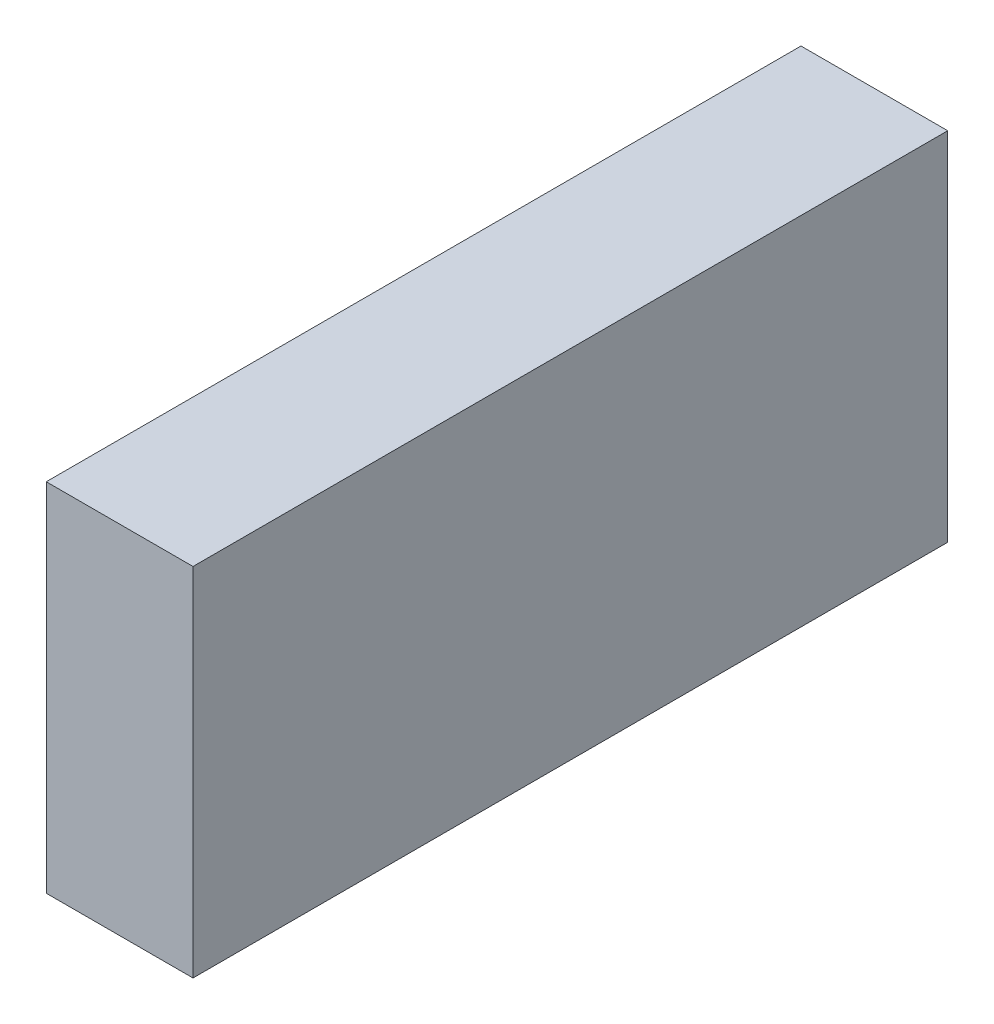
ISO-10303-21;
HEADER;
FILE_DESCRIPTION(('STEP AP214'),'2;1');
FILE_NAME('part.step','',(''),(''),'','','');
FILE_SCHEMA(('AUTOMOTIVE_DESIGN { 1 0 10303 214 1 1 1 1 }'));
ENDSEC;
DATA;
#1=APPLICATION_CONTEXT('core data for automotive mechanical design processes');
#2=APPLICATION_PROTOCOL_DEFINITION('international standard','automotive_design',2000,#1);
#3=PRODUCT_CONTEXT('',#1,'mechanical');
#4=PRODUCT('Part','Part','',(#3));
#5=PRODUCT_RELATED_PRODUCT_CATEGORY('part','',(#4));
#6=PRODUCT_DEFINITION_FORMATION('','',#4);
#7=PRODUCT_DEFINITION_CONTEXT('part definition',#1,'design');
#8=PRODUCT_DEFINITION('design','',#6,#7);
#9=PRODUCT_DEFINITION_SHAPE('','',#8);
#10=(LENGTH_UNIT() NAMED_UNIT(*) SI_UNIT(.MILLI.,.METRE.));
#11=(NAMED_UNIT(*) PLANE_ANGLE_UNIT() SI_UNIT($,.RADIAN.));
#12=(NAMED_UNIT(*) SI_UNIT($,.STERADIAN.) SOLID_ANGLE_UNIT());
#13=UNCERTAINTY_MEASURE_WITH_UNIT(LENGTH_MEASURE(1.E-05),#10,'distance_accuracy_value','');
#14=(GEOMETRIC_REPRESENTATION_CONTEXT(3) GLOBAL_UNCERTAINTY_ASSIGNED_CONTEXT((#13)) GLOBAL_UNIT_ASSIGNED_CONTEXT((#10,
#11,#12)) REPRESENTATION_CONTEXT('',''));
#15=CARTESIAN_POINT('',(0.,0.,0.));
#16=DIRECTION('',(0.,0.,1.));
#17=DIRECTION('',(1.,0.,0.));
#18=AXIS2_PLACEMENT_3D('',#15,#16,#17);
#19=CARTESIAN_POINT('',(7.,-17.,36.));
#20=DIRECTION('',(0.,0.,-1.));
#21=DIRECTION('',(-1.,0.,0.));
#22=AXIS2_PLACEMENT_3D('',#19,#20,#21);
#23=PLANE('',#22);
#24=DIRECTION('',(0.,-1.,0.));
#25=VECTOR('',#24,1.);
#26=CARTESIAN_POINT('',(-7.,-17.,36.));
#27=LINE('',#26,#25);
#28=CARTESIAN_POINT('',(-7.,17.,36.));
#29=VERTEX_POINT('',#28);
#30=CARTESIAN_POINT('',(-7.,-17.,36.));
#31=VERTEX_POINT('',#30);
#32=EDGE_CURVE('E95',#29,#31,#27,.T.);
#33=ORIENTED_EDGE('',*,*,#32,.T.);
#34=DIRECTION('',(-1.,0.,0.));
#35=VECTOR('',#34,1.);
#36=CARTESIAN_POINT('',(7.,-17.,36.));
#37=LINE('',#36,#35);
#38=CARTESIAN_POINT('',(7.,-17.,36.));
#39=VERTEX_POINT('',#38);
#40=EDGE_CURVE('E11',#39,#31,#37,.T.);
#41=ORIENTED_EDGE('',*,*,#40,.F.);
#42=DIRECTION('',(0.,-1.,0.));
#43=VECTOR('',#42,1.);
#44=CARTESIAN_POINT('',(7.,-17.,36.));
#45=LINE('',#44,#43);
#46=CARTESIAN_POINT('',(7.,17.,36.));
#47=VERTEX_POINT('',#46);
#48=EDGE_CURVE('E83',#47,#39,#45,.T.);
#49=ORIENTED_EDGE('',*,*,#48,.F.);
#50=DIRECTION('',(-1.,0.,0.));
#51=VECTOR('',#50,1.);
#52=CARTESIAN_POINT('',(7.,17.,36.));
#53=LINE('',#52,#51);
#54=EDGE_CURVE('E91',#47,#29,#53,.T.);
#55=ORIENTED_EDGE('',*,*,#54,.T.);
#56=EDGE_LOOP('',(#33,#41,#49,#55));
#57=FACE_BOUND('',#56,.T.);
#58=ADVANCED_FACE('F32',(#57),#23,.F.);
#59=CARTESIAN_POINT('',(7.,-17.,-36.));
#60=DIRECTION('',(0.,1.,0.));
#61=DIRECTION('',(0.,0.,1.));
#62=AXIS2_PLACEMENT_3D('',#59,#60,#61);
#63=PLANE('',#62);
#64=DIRECTION('',(0.,0.,-1.));
#65=VECTOR('',#64,1.);
#66=CARTESIAN_POINT('',(-7.,-17.,-36.));
#67=LINE('',#66,#65);
#68=CARTESIAN_POINT('',(-7.,-17.,-36.));
#69=VERTEX_POINT('',#68);
#70=EDGE_CURVE('E87',#31,#69,#67,.T.);
#71=ORIENTED_EDGE('',*,*,#70,.T.);
#72=DIRECTION('',(-1.,0.,0.));
#73=VECTOR('',#72,1.);
#74=CARTESIAN_POINT('',(7.,-17.,-36.));
#75=LINE('',#74,#73);
#76=CARTESIAN_POINT('',(7.,-17.,-36.));
#77=VERTEX_POINT('',#76);
#78=EDGE_CURVE('E40',#77,#69,#75,.T.);
#79=ORIENTED_EDGE('',*,*,#78,.F.);
#80=DIRECTION('',(0.,0.,-1.));
#81=VECTOR('',#80,1.);
#82=CARTESIAN_POINT('',(7.,-17.,-36.));
#83=LINE('',#82,#81);
#84=EDGE_CURVE('E78',#39,#77,#83,.T.);
#85=ORIENTED_EDGE('',*,*,#84,.F.);
#86=ORIENTED_EDGE('',*,*,#40,.T.);
#87=EDGE_LOOP('',(#71,#79,#85,#86));
#88=FACE_BOUND('',#87,.T.);
#89=ADVANCED_FACE('F86',(#88),#63,.F.);
#90=CARTESIAN_POINT('',(7.,-17.,-36.));
#91=DIRECTION('',(0.,0.,1.));
#92=DIRECTION('',(1.,0.,0.));
#93=AXIS2_PLACEMENT_3D('',#90,#91,#92);
#94=PLANE('',#93);
#95=DIRECTION('',(0.,1.,0.));
#96=VECTOR('',#95,1.);
#97=CARTESIAN_POINT('',(-7.,-17.,-36.));
#98=LINE('',#97,#96);
#99=CARTESIAN_POINT('',(-7.,17.,-36.));
#100=VERTEX_POINT('',#99);
#101=EDGE_CURVE('E65',#69,#100,#98,.T.);
#102=ORIENTED_EDGE('',*,*,#101,.T.);
#103=DIRECTION('',(-1.,0.,0.));
#104=VECTOR('',#103,1.);
#105=CARTESIAN_POINT('',(7.,17.,-36.));
#106=LINE('',#105,#104);
#107=CARTESIAN_POINT('',(7.,17.,-36.));
#108=VERTEX_POINT('',#107);
#109=EDGE_CURVE('E88',#108,#100,#106,.T.);
#110=ORIENTED_EDGE('',*,*,#109,.F.);
#111=DIRECTION('',(0.,1.,0.));
#112=VECTOR('',#111,1.);
#113=CARTESIAN_POINT('',(7.,-17.,-36.));
#114=LINE('',#113,#112);
#115=EDGE_CURVE('E81',#77,#108,#114,.T.);
#116=ORIENTED_EDGE('',*,*,#115,.F.);
#117=ORIENTED_EDGE('',*,*,#78,.T.);
#118=EDGE_LOOP('',(#102,#110,#116,#117));
#119=FACE_BOUND('',#118,.T.);
#120=ADVANCED_FACE('F89',(#119),#94,.F.);
#121=CARTESIAN_POINT('',(7.,17.,-36.));
#122=DIRECTION('',(0.,-1.,0.));
#123=DIRECTION('',(0.,0.,-1.));
#124=AXIS2_PLACEMENT_3D('',#121,#122,#123);
#125=PLANE('',#124);
#126=DIRECTION('',(0.,0.,1.));
#127=VECTOR('',#126,1.);
#128=CARTESIAN_POINT('',(-7.,17.,-36.));
#129=LINE('',#128,#127);
#130=EDGE_CURVE('E71',#100,#29,#129,.T.);
#131=ORIENTED_EDGE('',*,*,#130,.T.);
#132=ORIENTED_EDGE('',*,*,#54,.F.);
#133=DIRECTION('',(0.,0.,1.));
#134=VECTOR('',#133,1.);
#135=CARTESIAN_POINT('',(7.,17.,-36.));
#136=LINE('',#135,#134);
#137=EDGE_CURVE('E48',#108,#47,#136,.T.);
#138=ORIENTED_EDGE('',*,*,#137,.F.);
#139=ORIENTED_EDGE('',*,*,#109,.T.);
#140=EDGE_LOOP('',(#131,#132,#138,#139));
#141=FACE_BOUND('',#140,.T.);
#142=ADVANCED_FACE('F102',(#141),#125,.F.);
#143=CARTESIAN_POINT('',(7.,0.,0.));
#144=DIRECTION('',(1.,0.,0.));
#145=DIRECTION('',(0.,0.,-1.));
#146=AXIS2_PLACEMENT_3D('',#143,#144,#145);
#147=PLANE('',#146);
#148=ORIENTED_EDGE('',*,*,#48,.T.);
#149=ORIENTED_EDGE('',*,*,#84,.T.);
#150=ORIENTED_EDGE('',*,*,#115,.T.);
#151=ORIENTED_EDGE('',*,*,#137,.T.);
#152=EDGE_LOOP('',(#148,#149,#150,#151));
#153=FACE_BOUND('',#152,.T.);
#154=ADVANCED_FACE('F79',(#153),#147,.T.);
#155=CARTESIAN_POINT('',(-7.,0.,0.));
#156=DIRECTION('',(1.,0.,0.));
#157=DIRECTION('',(0.,0.,-1.));
#158=AXIS2_PLACEMENT_3D('',#155,#156,#157);
#159=PLANE('',#158);
#160=ORIENTED_EDGE('',*,*,#32,.F.);
#161=ORIENTED_EDGE('',*,*,#130,.F.);
#162=ORIENTED_EDGE('',*,*,#101,.F.);
#163=ORIENTED_EDGE('',*,*,#70,.F.);
#164=EDGE_LOOP('',(#160,#161,#162,#163));
#165=FACE_BOUND('',#164,.T.);
#166=ADVANCED_FACE('F105',(#165),#159,.F.);
#167=CLOSED_SHELL('',(#58,#89,#120,#142,#154,#166));
#168=MANIFOLD_SOLID_BREP('B2',#167);
#169=ADVANCED_BREP_SHAPE_REPRESENTATION('',(#18,#168),#14);
#170=SHAPE_DEFINITION_REPRESENTATION(#9,#169);
ENDSEC;
END-ISO-10303-21;
